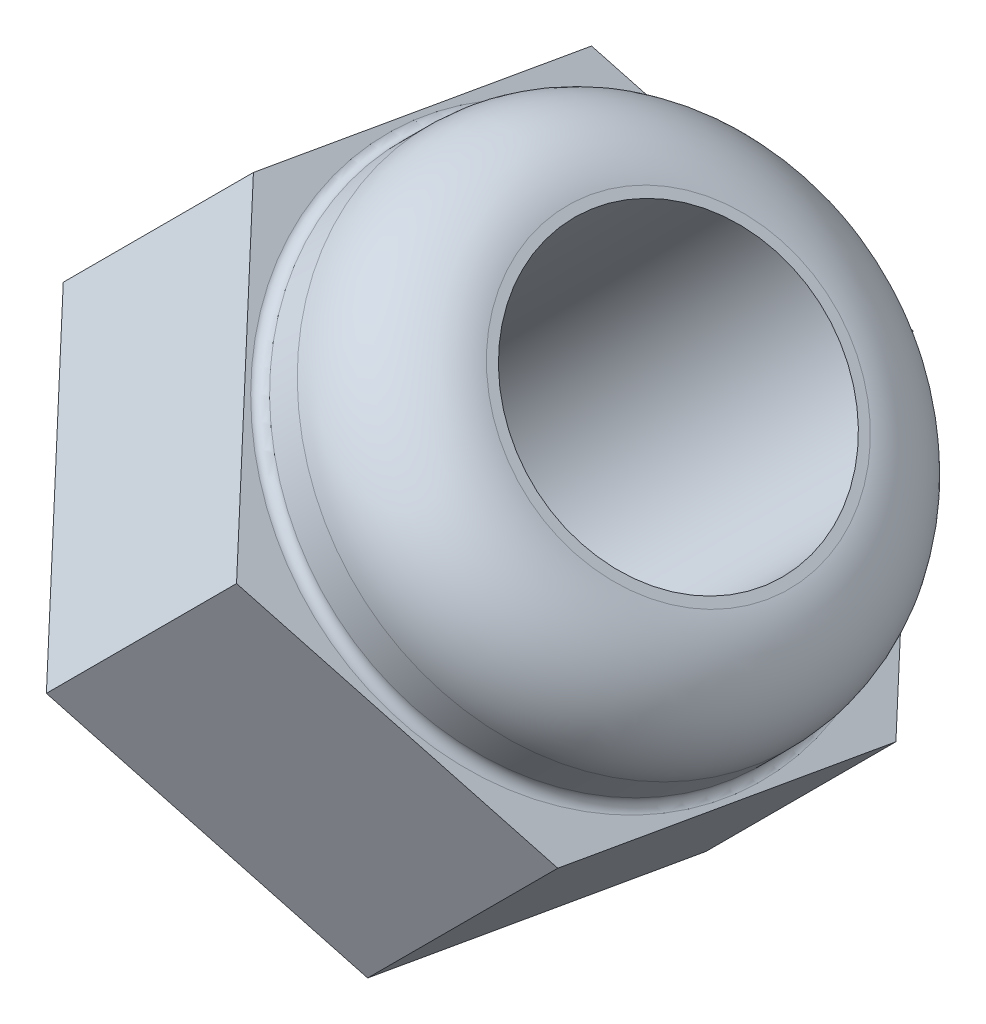
ISO-10303-21;
HEADER;
FILE_DESCRIPTION(('STEP AP214'),'2;1');
FILE_NAME('part.step','',(''),(''),'','','');
FILE_SCHEMA(('AUTOMOTIVE_DESIGN { 1 0 10303 214 1 1 1 1 }'));
ENDSEC;
DATA;
#1=APPLICATION_CONTEXT('core data for automotive mechanical design processes');
#2=APPLICATION_PROTOCOL_DEFINITION('international standard','automotive_design',2000,#1);
#3=PRODUCT_CONTEXT('',#1,'mechanical');
#4=PRODUCT('Part','Part','',(#3));
#5=PRODUCT_RELATED_PRODUCT_CATEGORY('part','',(#4));
#6=PRODUCT_DEFINITION_FORMATION('','',#4);
#7=PRODUCT_DEFINITION_CONTEXT('part definition',#1,'design');
#8=PRODUCT_DEFINITION('design','',#6,#7);
#9=PRODUCT_DEFINITION_SHAPE('','',#8);
#10=(LENGTH_UNIT() NAMED_UNIT(*) SI_UNIT(.MILLI.,.METRE.));
#11=(NAMED_UNIT(*) PLANE_ANGLE_UNIT() SI_UNIT($,.RADIAN.));
#12=(NAMED_UNIT(*) SI_UNIT($,.STERADIAN.) SOLID_ANGLE_UNIT());
#13=UNCERTAINTY_MEASURE_WITH_UNIT(LENGTH_MEASURE(1.E-05),#10,'distance_accuracy_value','');
#14=(GEOMETRIC_REPRESENTATION_CONTEXT(3) GLOBAL_UNCERTAINTY_ASSIGNED_CONTEXT((#13)) GLOBAL_UNIT_ASSIGNED_CONTEXT((#10,
#11,#12)) REPRESENTATION_CONTEXT('',''));
#15=CARTESIAN_POINT('',(0.,0.,0.));
#16=DIRECTION('',(0.,0.,1.));
#17=DIRECTION('',(1.,0.,0.));
#18=AXIS2_PLACEMENT_3D('',#15,#16,#17);
#19=CARTESIAN_POINT('',(21.6858471925757,-1.24490551912351,53.5324256023025));
#20=DIRECTION('',(-0.707105990182409,-0.707106781189412,-0.0010576597300079));
#21=DIRECTION('',(0.70710717669016,-0.707106385682714,0.));
#22=AXIS2_PLACEMENT_3D('',#19,#20,#21);
#23=CYLINDRICAL_SURFACE('',#22,1.50000000000209);
#24=CARTESIAN_POINT('',(18.6806467342998,-4.25010933917915,53.52793054845));
#25=DIRECTION('',(-0.707105990182409,-0.707106781189412,-0.0010576597300079));
#26=DIRECTION('',(0.70710717669016,-0.707106385682714,0.));
#27=AXIS2_PLACEMENT_3D('',#24,#25,#26);
#28=CIRCLE('',#27,1.50000000000209);
#29=CARTESIAN_POINT('',(19.7413074993366,-5.3107689177047,53.52793054845));
#30=VERTEX_POINT('',#29);
#31=EDGE_CURVE('E105',#30,#30,#28,.T.);
#32=ORIENTED_EDGE('',*,*,#31,.T.);
#33=EDGE_LOOP('',(#32));
#34=FACE_BOUND('',#33,.T.);
#35=CARTESIAN_POINT('',(21.6858471925757,-1.2449055191235,53.5324256023025));
#36=DIRECTION('',(-0.707105990182409,-0.707106781189412,-0.0010576597300079));
#37=DIRECTION('',(0.70710717669016,-0.707106385682714,0.));
#38=AXIS2_PLACEMENT_3D('',#35,#36,#37);
#39=CIRCLE('',#38,1.50000000000209);
#40=CARTESIAN_POINT('',(22.7465079576124,-2.30556509764906,53.5324256023025));
#41=VERTEX_POINT('',#40);
#42=EDGE_CURVE('E109',#41,#41,#39,.T.);
#43=ORIENTED_EDGE('',*,*,#42,.F.);
#44=EDGE_LOOP('',(#43));
#45=FACE_BOUND('',#44,.T.);
#46=ADVANCED_FACE('F17',(#34,#45),#23,.F.);
#47=CARTESIAN_POINT('',(22.3396108327,-1.895384239648,51.33675554806));
#48=DIRECTION('',(0.707105990185708,0.707106781186113,0.00105765972954669));
#49=DIRECTION('',(-0.654896304312644,0.65433001927902,0.378104557586863));
#50=AXIS2_PLACEMENT_3D('',#47,#48,#49);
#51=PLANE('',#50);
#52=ORIENTED_EDGE('',*,*,#42,.T.);
#53=EDGE_LOOP('',(#52));
#54=FACE_BOUND('',#53,.T.);
#55=CARTESIAN_POINT('',(21.6858471925919,-1.2449055191341,53.5324256023));
#56=DIRECTION('',(-0.707105990182912,-0.707106781188909,-0.0010576597300029));
#57=DIRECTION('',(0.654896304315399,-0.654330019276355,-0.378104557586704));
#58=AXIS2_PLACEMENT_3D('',#55,#56,#57);
#59=CIRCLE('',#58,1.60000000000454);
#60=CARTESIAN_POINT('',(20.6380131056867,-0.197977488289296,54.1373928944396));
#61=VERTEX_POINT('',#60);
#62=CARTESIAN_POINT('',(22.7336812794955,-2.29183354998003,52.9274583101603));
#63=VERTEX_POINT('',#62);
#64=EDGE_CURVE('E112',#61,#63,#59,.F.);
#65=ORIENTED_EDGE('',*,*,#64,.T.);
#66=CARTESIAN_POINT('',(21.6858471925919,-1.24490551913411,53.5324256023));
#67=DIRECTION('',(-0.707105990182912,-0.707106781188909,-0.0010576597300029));
#68=DIRECTION('',(-0.654896304315344,0.6543300192763,0.378104557586894));
#69=AXIS2_PLACEMENT_3D('',#66,#67,#68);
#70=CIRCLE('',#69,1.60000000000454);
#71=EDGE_CURVE('E108',#63,#61,#70,.F.);
#72=ORIENTED_EDGE('',*,*,#71,.T.);
#73=EDGE_LOOP('',(#65,#72));
#74=FACE_BOUND('',#73,.T.);
#75=ADVANCED_FACE('F189',(#54,#74),#51,.T.);
#76=CARTESIAN_POINT('',(20.10668673941,-5.670297346163,49.61659740677));
#77=DIRECTION('',(0.707105990184872,0.707106781186948,0.00105765972991667));
#78=DIRECTION('',(-0.654896304313648,0.65433001927828,0.378104557586406));
#79=AXIS2_PLACEMENT_3D('',#76,#77,#78);
#80=PLANE('',#79);
#81=ORIENTED_EDGE('',*,*,#31,.F.);
#82=EDGE_LOOP('',(#81));
#83=FACE_BOUND('',#82,.T.);
#84=DIRECTION('',(0.0965066835306252,-0.0950246008279067,-0.990785943214485));
#85=VECTOR('',#84,1.);
#86=CARTESIAN_POINT('',(20.6069968618152,-6.17701439252423,53.9003712841852));
#87=LINE('',#86,#85);
#88=CARTESIAN_POINT('',(20.4537719225966,-6.02614257563793,55.4734552445063));
#89=VERTEX_POINT('',#88);
#90=CARTESIAN_POINT('',(20.7602218010186,-6.32788620939661,52.3272873240144));
#91=VERTEX_POINT('',#90);
#92=EDGE_CURVE('E147',#89,#91,#87,.T.);
#93=ORIENTED_EDGE('',*,*,#92,.F.);
#94=DIRECTION('',(0.654896304313877,-0.654330019277818,-0.378104557586808));
#95=VECTOR('',#94,1.);
#96=CARTESIAN_POINT('',(19.4139843892302,-4.98725414052223,56.0737768567951));
#97=LINE('',#96,#95);
#98=CARTESIAN_POINT('',(18.3741968558657,-3.94836570540658,56.6740984690834));
#99=VERTEX_POINT('',#98);
#100=EDGE_CURVE('E151',#99,#89,#97,.T.);
#101=ORIENTED_EDGE('',*,*,#100,.F.);
#102=DIRECTION('',(0.558389620780418,-0.559305418449808,0.61268138562991));
#103=VECTOR('',#102,1.);
#104=CARTESIAN_POINT('',(17.4876342617202,-3.06034908717723,55.7013361210501));
#105=LINE('',#104,#103);
#106=CARTESIAN_POINT('',(16.6010716675916,-2.17233246896125,54.7285737728784));
#107=VERTEX_POINT('',#106);
#108=EDGE_CURVE('E85',#107,#99,#105,.T.);
#109=ORIENTED_EDGE('',*,*,#108,.F.);
#110=DIRECTION('',(-0.096506683530626,0.0950246008282042,0.990785943214456));
#111=VECTOR('',#110,1.);
#112=CARTESIAN_POINT('',(16.7542966067952,-2.32320428583373,53.1554898127052));
#113=LINE('',#112,#111);
#114=CARTESIAN_POINT('',(16.9075215460136,-2.4740761027204,51.5824058523866));
#115=VERTEX_POINT('',#114);
#116=EDGE_CURVE('E81',#115,#107,#113,.T.);
#117=ORIENTED_EDGE('',*,*,#116,.F.);
#118=DIRECTION('',(-0.654896304312995,0.654330019279668,0.378104557585135));
#119=VECTOR('',#118,1.);
#120=CARTESIAN_POINT('',(17.9473090793752,-3.51296453783574,50.9820842401001));
#121=LINE('',#120,#119);
#122=CARTESIAN_POINT('',(18.9870966127384,-4.55185297295128,50.3817626278166));
#123=VERTEX_POINT('',#122);
#124=EDGE_CURVE('E156',#123,#115,#121,.T.);
#125=ORIENTED_EDGE('',*,*,#124,.F.);
#126=DIRECTION('',(-0.558389620783519,0.559305418449879,-0.612681385627019));
#127=VECTOR('',#126,1.);
#128=CARTESIAN_POINT('',(19.8736592068852,-5.43986959118123,51.354524975845));
#129=LINE('',#128,#127);
#130=EDGE_CURVE('E137',#91,#123,#129,.T.);
#131=ORIENTED_EDGE('',*,*,#130,.F.);
#132=EDGE_LOOP('',(#93,#101,#109,#117,#125,#131));
#133=FACE_BOUND('',#132,.T.);
#134=ADVANCED_FACE('F166',(#83,#133),#80,.F.);
#135=CARTESIAN_POINT('',(20.978741202409,-1.95201230032301,53.53136794257));
#136=DIRECTION('',(0.707105990182912,0.707106781188909,0.0010576597300029));
#137=DIRECTION('',(-0.65489630431559,0.654330019276547,0.378104557586041));
#138=AXIS2_PLACEMENT_3D('',#135,#136,#137);
#139=TOROIDAL_SURFACE('',#138,1.60000000000617,1.);
#140=ORIENTED_EDGE('',*,*,#64,.F.);
#141=ORIENTED_EDGE('',*,*,#71,.F.);
#142=EDGE_LOOP('',(#140,#141));
#143=FACE_BOUND('',#142,.T.);
#144=CARTESIAN_POINT('',(20.9787412024017,-1.95201230032581,53.531367942565));
#145=DIRECTION('',(0.707105990187408,0.707106781184412,0.00105765972999468));
#146=DIRECTION('',(-0.654896304310524,0.654330019279806,0.378104557589174));
#147=AXIS2_PLACEMENT_3D('',#144,#145,#146);
#148=CIRCLE('',#147,2.60000000000071);
#149=CARTESIAN_POINT('',(19.2760108111939,-0.250754250197849,54.5144397922971));
#150=VERTEX_POINT('',#149);
#151=EDGE_CURVE('E101',#150,#150,#148,.T.);
#152=ORIENTED_EDGE('',*,*,#151,.T.);
#153=EDGE_LOOP('',(#152));
#154=FACE_BOUND('',#153,.T.);
#155=ADVANCED_FACE('F161',(#143,#154),#139,.T.);
#156=CARTESIAN_POINT('',(18.98979728461,-4.632299383321,50.35769159204));
#157=DIRECTION('',(-0.266668238156177,0.26805265503142,-0.925762293944448));
#158=DIRECTION('',(-0.654896304313012,0.654330019279678,0.378104557585086));
#159=AXIS2_PLACEMENT_3D('',#156,#157,#158);
#160=PLANE('',#159);
#161=ORIENTED_EDGE('',*,*,#124,.T.);
#162=DIRECTION('',(-0.707105990185194,-0.707106781186625,-0.0010576597307681));
#163=VECTOR('',#162,1.);
#164=CARTESIAN_POINT('',(17.8797922825163,-1.50180427858849,51.5838601345177));
#165=LINE('',#164,#163);
#166=CARTESIAN_POINT('',(18.8520630190229,-0.529532454456595,51.5853144166442));
#167=VERTEX_POINT('',#166);
#168=EDGE_CURVE('E67',#167,#115,#165,.T.);
#169=ORIENTED_EDGE('',*,*,#168,.F.);
#170=DIRECTION('',(-0.654896304313616,0.654330019278322,0.378104557586389));
#171=VECTOR('',#170,1.);
#172=CARTESIAN_POINT('',(19.8918505523871,-1.56842088957248,50.9849928043538));
#173=LINE('',#172,#171);
#174=CARTESIAN_POINT('',(20.9316380857499,-2.60730932468694,50.3846711920663));
#175=VERTEX_POINT('',#174);
#176=EDGE_CURVE('E99',#175,#167,#173,.T.);
#177=ORIENTED_EDGE('',*,*,#176,.F.);
#178=DIRECTION('',(0.707105990185214,0.707106781186611,0.00105765972726957));
#179=VECTOR('',#178,1.);
#180=CARTESIAN_POINT('',(19.959367349241,-3.57958114882025,50.3832169099412));
#181=LINE('',#180,#179);
#182=EDGE_CURVE('E145',#123,#175,#181,.T.);
#183=ORIENTED_EDGE('',*,*,#182,.F.);
#184=EDGE_LOOP('',(#161,#169,#177,#183));
#185=FACE_BOUND('',#184,.T.);
#186=ADVANCED_FACE('F165',(#185),#160,.T.);
#187=CARTESIAN_POINT('',(16.87475971412,-2.519001848361,51.51942432269));
#188=DIRECTION('',(-0.700490955457602,0.700692746671148,-0.13543299481492));
#189=DIRECTION('',(-0.096506683530626,0.0950246008282072,0.990785943214456));
#190=AXIS2_PLACEMENT_3D('',#187,#188,#189);
#191=PLANE('',#190);
#192=ORIENTED_EDGE('',*,*,#116,.T.);
#193=DIRECTION('',(-0.707105990185159,-0.70710678118666,-0.00105765973070739));
#194=VECTOR('',#193,1.);
#195=CARTESIAN_POINT('',(17.5733424040808,-1.20006064481602,54.7300280551462));
#196=LINE('',#195,#194);
#197=CARTESIAN_POINT('',(18.5456131405867,-0.227788820684024,54.7314823372752));
#198=VERTEX_POINT('',#197);
#199=EDGE_CURVE('E73',#198,#107,#196,.T.);
#200=ORIENTED_EDGE('',*,*,#199,.F.);
#201=DIRECTION('',(-0.0965066835318591,0.0950246008281578,0.990785943214341));
#202=VECTOR('',#201,1.);
#203=CARTESIAN_POINT('',(18.8520630190234,-0.529532454457088,51.5853144166408));
#204=LINE('',#203,#202);
#205=EDGE_CURVE('E77',#167,#198,#204,.T.);
#206=ORIENTED_EDGE('',*,*,#205,.F.);
#207=ORIENTED_EDGE('',*,*,#168,.T.);
#208=EDGE_LOOP('',(#192,#200,#206,#207));
#209=FACE_BOUND('',#208,.T.);
#210=ADVANCED_FACE('F75',(#209),#191,.T.);
#211=CARTESIAN_POINT('',(16.52671833435,-2.175702677184,54.68960510781));
#212=DIRECTION('',(-0.433822717304073,0.432640091637895,0.79032929912693));
#213=DIRECTION('',(0.5583896207804,-0.559305418449787,0.612681385629946));
#214=AXIS2_PLACEMENT_3D('',#211,#212,#213);
#215=PLANE('',#214);
#216=ORIENTED_EDGE('',*,*,#108,.T.);
#217=DIRECTION('',(-0.707105990185213,-0.707106781186612,-0.00105765972734235));
#218=VECTOR('',#217,1.);
#219=CARTESIAN_POINT('',(19.3464675923696,-2.97609388127463,56.6755527512085));
#220=LINE('',#219,#218);
#221=CARTESIAN_POINT('',(20.3187383288779,-2.00382205714218,56.6770070333336));
#222=VERTEX_POINT('',#221);
#223=EDGE_CURVE('E91',#222,#99,#220,.T.);
#224=ORIENTED_EDGE('',*,*,#223,.F.);
#225=DIRECTION('',(0.558389620782064,-0.559305418450472,0.612681385627803));
#226=VECTOR('',#225,1.);
#227=CARTESIAN_POINT('',(18.5456131405869,-0.227788820684241,54.7314823372743));
#228=LINE('',#227,#226);
#229=EDGE_CURVE('E88',#198,#222,#228,.T.);
#230=ORIENTED_EDGE('',*,*,#229,.F.);
#231=ORIENTED_EDGE('',*,*,#199,.T.);
#232=EDGE_LOOP('',(#216,#224,#230,#231));
#233=FACE_BOUND('',#232,.T.);
#234=ADVANCED_FACE('F89',(#233),#215,.T.);
#235=CARTESIAN_POINT('',(18.29371452507,-3.945701040967,56.69805316229));
#236=DIRECTION('',(0.266668238157494,-0.268052655032611,0.925762293943724));
#237=DIRECTION('',(0.654896304313863,-0.654330019277803,-0.378104557586858));
#238=AXIS2_PLACEMENT_3D('',#235,#236,#237);
#239=PLANE('',#238);
#240=ORIENTED_EDGE('',*,*,#100,.T.);
#241=DIRECTION('',(-0.707105990185212,-0.707106781186608,-0.00105765973076085));
#242=VECTOR('',#241,1.);
#243=CARTESIAN_POINT('',(21.4260426591037,-5.05387075150644,55.4749095266323));
#244=LINE('',#243,#242);
#245=CARTESIAN_POINT('',(22.3983133956068,-4.08159892737458,55.4763638087606));
#246=VERTEX_POINT('',#245);
#247=EDGE_CURVE('E150',#246,#89,#244,.T.);
#248=ORIENTED_EDGE('',*,*,#247,.F.);
#249=DIRECTION('',(0.654896304313597,-0.654330019278347,-0.378104557586377));
#250=VECTOR('',#249,1.);
#251=CARTESIAN_POINT('',(21.3585258622429,-3.04271049225887,56.0766854210462));
#252=LINE('',#251,#250);
#253=EDGE_CURVE('E95',#222,#246,#252,.T.);
#254=ORIENTED_EDGE('',*,*,#253,.F.);
#255=ORIENTED_EDGE('',*,*,#223,.T.);
#256=EDGE_LOOP('',(#240,#248,#254,#255));
#257=FACE_BOUND('',#256,.T.);
#258=ADVANCED_FACE('F257',(#257),#239,.T.);
#259=CARTESIAN_POINT('',(20.40875209557,-6.058998575928,55.53632043163));
#260=DIRECTION('',(0.700490955457604,-0.700692746671188,0.135432994814707));
#261=DIRECTION('',(0.0965066835306252,-0.095024600827907,-0.990785943214485));
#262=AXIS2_PLACEMENT_3D('',#259,#260,#261);
#263=PLANE('',#262);
#264=ORIENTED_EDGE('',*,*,#92,.T.);
#265=DIRECTION('',(-0.707105990185215,-0.70710678118661,-0.00105765972727442));
#266=VECTOR('',#265,1.);
#267=CARTESIAN_POINT('',(21.732492537539,-5.35561438527883,52.3287416059989));
#268=LINE('',#267,#266);
#269=CARTESIAN_POINT('',(22.7047632740432,-4.38334256114732,52.3301958881248));
#270=VERTEX_POINT('',#269);
#271=EDGE_CURVE('E146',#270,#91,#268,.T.);
#272=ORIENTED_EDGE('',*,*,#271,.F.);
#273=DIRECTION('',(0.0965066835318493,-0.0950246008281468,-0.990785943214343));
#274=VECTOR('',#273,1.);
#275=CARTESIAN_POINT('',(22.3983133956065,-4.08159892737437,55.4763638087592));
#276=LINE('',#275,#274);
#277=EDGE_CURVE('E229',#246,#270,#276,.T.);
#278=ORIENTED_EDGE('',*,*,#277,.F.);
#279=ORIENTED_EDGE('',*,*,#247,.T.);
#280=EDGE_LOOP('',(#264,#272,#278,#279));
#281=FACE_BOUND('',#280,.T.);
#282=ADVANCED_FACE('F240',(#281),#263,.T.);
#283=CARTESIAN_POINT('',(20.75679347534,-6.402297747105,52.36613964651));
#284=DIRECTION('',(0.433822717300013,-0.432640091637813,-0.790329299129203));
#285=DIRECTION('',(-0.558389620783519,0.559305418449879,-0.612681385627019));
#286=AXIS2_PLACEMENT_3D('',#283,#284,#285);
#287=PLANE('',#286);
#288=ORIENTED_EDGE('',*,*,#130,.T.);
#289=ORIENTED_EDGE('',*,*,#182,.T.);
#290=DIRECTION('',(-0.558389620782068,0.559305418450476,-0.612681385627795));
#291=VECTOR('',#290,1.);
#292=CARTESIAN_POINT('',(22.704763274043,-4.38334256114719,52.3301958881257));
#293=LINE('',#292,#291);
#294=EDGE_CURVE('E236',#270,#175,#293,.T.);
#295=ORIENTED_EDGE('',*,*,#294,.F.);
#296=ORIENTED_EDGE('',*,*,#271,.T.);
#297=EDGE_LOOP('',(#288,#289,#295,#296));
#298=FACE_BOUND('',#297,.T.);
#299=ADVANCED_FACE('F246',(#298),#287,.T.);
#300=CARTESIAN_POINT('',(20.6958988063249,-2.23485501280142,53.530944878673));
#301=DIRECTION('',(0.707105990187408,0.707106781184412,0.00105765972999519));
#302=DIRECTION('',(-0.70710717668516,0.707106385687714,0.));
#303=AXIS2_PLACEMENT_3D('',#300,#301,#302);
#304=CYLINDRICAL_SURFACE('',#303,2.60000000000089);
#305=ORIENTED_EDGE('',*,*,#151,.F.);
#306=EDGE_LOOP('',(#305));
#307=FACE_BOUND('',#306,.T.);
#308=CARTESIAN_POINT('',(20.6958988063278,-2.23485501279919,53.53094487868));
#309=DIRECTION('',(0.707105990187412,0.707106781184409,0.00105765972999467));
#310=DIRECTION('',(-0.654896304311472,0.654330019280764,0.378104557585877));
#311=AXIS2_PLACEMENT_3D('',#308,#309,#310);
#312=CIRCLE('',#311,2.59999999999488);
#313=CARTESIAN_POINT('',(18.9931684151213,-0.533596962672558,54.5140167284013));
#314=VERTEX_POINT('',#313);
#315=EDGE_CURVE('E30',#314,#314,#312,.F.);
#316=ORIENTED_EDGE('',*,*,#315,.F.);
#317=EDGE_LOOP('',(#316));
#318=FACE_BOUND('',#317,.T.);
#319=ADVANCED_FACE('F129',(#307,#318),#304,.T.);
#320=CARTESIAN_POINT('',(22.05122821242,-3.7257536979,49.61950597102));
#321=DIRECTION('',(0.707105990184907,0.707106781186914,0.00105765972989866));
#322=DIRECTION('',(-0.654896304313615,0.654330019278322,0.37810455758639));
#323=AXIS2_PLACEMENT_3D('',#320,#321,#322);
#324=PLANE('',#323);
#325=CARTESIAN_POINT('',(20.6251882073089,-2.30556569091784,53.530839112707));
#326=DIRECTION('',(0.707105990187412,0.707106781184409,0.00105765972999467));
#327=DIRECTION('',(0.654896304311393,-0.654330019280686,-0.378104557586148));
#328=AXIS2_PLACEMENT_3D('',#325,#326,#327);
#329=CIRCLE('',#328,2.69999999999477);
#330=CARTESIAN_POINT('',(22.3934082289527,-4.07225674297053,52.5099568072224));
#331=VERTEX_POINT('',#330);
#332=CARTESIAN_POINT('',(18.8569681856699,-0.538874638863385,54.5517214181859));
#333=VERTEX_POINT('',#332);
#334=EDGE_CURVE('E11',#331,#333,#329,.T.);
#335=ORIENTED_EDGE('',*,*,#334,.F.);
#336=CARTESIAN_POINT('',(20.6251882073089,-2.30556569091784,53.530839112707));
#337=DIRECTION('',(0.707105990187412,0.707106781184409,0.00105765972999467));
#338=DIRECTION('',(-0.65489630431145,0.654330019280743,0.37810455758595));
#339=AXIS2_PLACEMENT_3D('',#336,#337,#338);
#340=CIRCLE('',#339,2.69999999999477);
#341=EDGE_CURVE('E37',#331,#333,#340,.F.);
#342=ORIENTED_EDGE('',*,*,#341,.T.);
#343=EDGE_LOOP('',(#335,#342));
#344=FACE_BOUND('',#343,.T.);
#345=ORIENTED_EDGE('',*,*,#277,.T.);
#346=ORIENTED_EDGE('',*,*,#294,.T.);
#347=ORIENTED_EDGE('',*,*,#176,.T.);
#348=ORIENTED_EDGE('',*,*,#205,.T.);
#349=ORIENTED_EDGE('',*,*,#229,.T.);
#350=ORIENTED_EDGE('',*,*,#253,.T.);
#351=EDGE_LOOP('',(#345,#346,#347,#348,#349,#350));
#352=FACE_BOUND('',#351,.T.);
#353=ADVANCED_FACE('F19',(#344,#352),#324,.T.);
#354=CARTESIAN_POINT('',(20.6958988063276,-2.23485501279939,53.53094487868));
#355=DIRECTION('',(0.707105990187412,0.707106781184409,0.00105765972999467));
#356=DIRECTION('',(-0.654896304311465,0.654330019280757,0.3781045575859));
#357=AXIS2_PLACEMENT_3D('',#354,#355,#356);
#358=TOROIDAL_SURFACE('',#357,2.69999999999488,0.1);
#359=ORIENTED_EDGE('',*,*,#315,.T.);
#360=EDGE_LOOP('',(#359));
#361=FACE_BOUND('',#360,.T.);
#362=ORIENTED_EDGE('',*,*,#334,.T.);
#363=ORIENTED_EDGE('',*,*,#341,.F.);
#364=EDGE_LOOP('',(#362,#363));
#365=FACE_BOUND('',#364,.T.);
#366=ADVANCED_FACE('F118',(#361,#365),#358,.F.);
#367=CLOSED_SHELL('',(#46,#75,#134,#155,#186,#210,#234,#258,#282,#299,#319,#353,#366));
#368=MANIFOLD_SOLID_BREP('B1',#367);
#369=ADVANCED_BREP_SHAPE_REPRESENTATION('',(#18,#368),#14);
#370=SHAPE_DEFINITION_REPRESENTATION(#9,#369);
ENDSEC;
END-ISO-10303-21;
